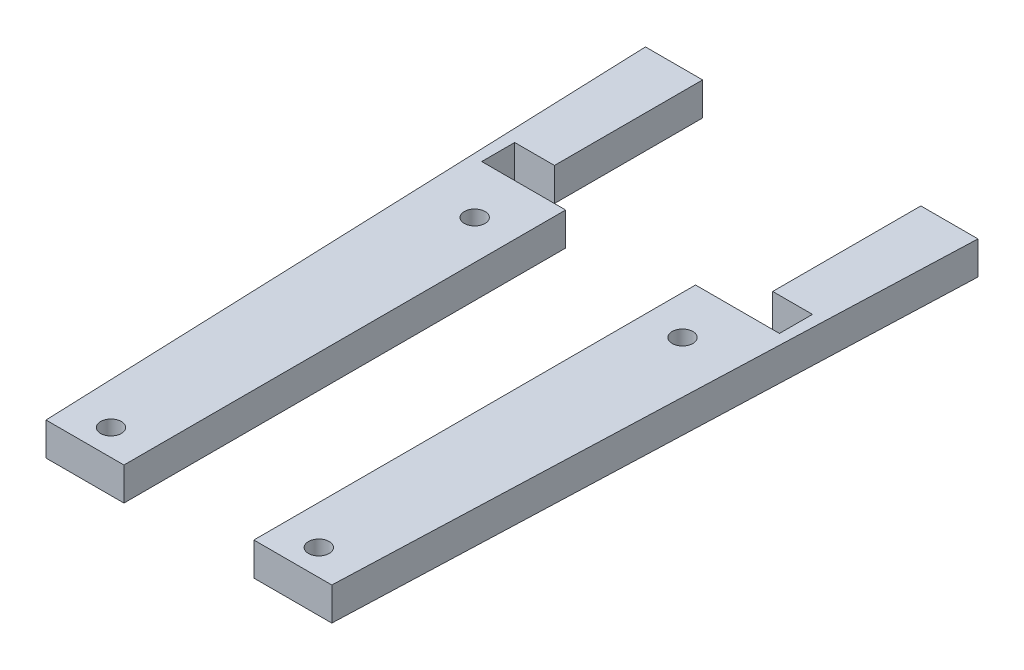
ISO-10303-21;
HEADER;
FILE_DESCRIPTION(('STEP AP214'),'2;1');
FILE_NAME('part.step','',(''),(''),'','','');
FILE_SCHEMA(('AUTOMOTIVE_DESIGN { 1 0 10303 214 1 1 1 1 }'));
ENDSEC;
DATA;
#1=APPLICATION_CONTEXT('core data for automotive mechanical design processes');
#2=APPLICATION_PROTOCOL_DEFINITION('international standard','automotive_design',2000,#1);
#3=PRODUCT_CONTEXT('',#1,'mechanical');
#4=PRODUCT('Part','Part','',(#3));
#5=PRODUCT_RELATED_PRODUCT_CATEGORY('part','',(#4));
#6=PRODUCT_DEFINITION_FORMATION('','',#4);
#7=PRODUCT_DEFINITION_CONTEXT('part definition',#1,'design');
#8=PRODUCT_DEFINITION('design','',#6,#7);
#9=PRODUCT_DEFINITION_SHAPE('','',#8);
#10=(LENGTH_UNIT() NAMED_UNIT(*) SI_UNIT(.MILLI.,.METRE.));
#11=(NAMED_UNIT(*) PLANE_ANGLE_UNIT() SI_UNIT($,.RADIAN.));
#12=(NAMED_UNIT(*) SI_UNIT($,.STERADIAN.) SOLID_ANGLE_UNIT());
#13=UNCERTAINTY_MEASURE_WITH_UNIT(LENGTH_MEASURE(1.E-05),#10,'distance_accuracy_value','');
#14=(GEOMETRIC_REPRESENTATION_CONTEXT(3) GLOBAL_UNCERTAINTY_ASSIGNED_CONTEXT((#13)) GLOBAL_UNIT_ASSIGNED_CONTEXT((#10,
#11,#12)) REPRESENTATION_CONTEXT('',''));
#15=CARTESIAN_POINT('',(0.,0.,0.));
#16=DIRECTION('',(0.,0.,1.));
#17=DIRECTION('',(1.,0.,0.));
#18=AXIS2_PLACEMENT_3D('',#15,#16,#17);
#19=CARTESIAN_POINT('',(0.,3.175,0.));
#20=DIRECTION('',(0.,1.,0.));
#21=DIRECTION('',(0.,0.,1.));
#22=AXIS2_PLACEMENT_3D('',#19,#20,#21);
#23=PLANE('',#22);
#24=CARTESIAN_POINT('',(-20.,3.175,194.859325526731));
#25=DIRECTION('',(0.,1.,0.));
#26=DIRECTION('',(0.,0.,1.));
#27=AXIS2_PLACEMENT_3D('',#24,#25,#26);
#28=CIRCLE('',#27,2.00000000000001);
#29=CARTESIAN_POINT('',(-20.,3.175,196.859325526731));
#30=VERTEX_POINT('',#29);
#31=EDGE_CURVE('E183',#30,#30,#28,.T.);
#32=ORIENTED_EDGE('',*,*,#31,.F.);
#33=EDGE_LOOP('',(#32));
#34=FACE_BOUND('',#33,.T.);
#35=CARTESIAN_POINT('',(-20.,3.175,124.859325526731));
#36=DIRECTION('',(0.,1.,0.));
#37=DIRECTION('',(0.,0.,-1.));
#38=AXIS2_PLACEMENT_3D('',#35,#36,#37);
#39=CIRCLE('',#38,2.00000000000001);
#40=CARTESIAN_POINT('',(-20.,3.175,122.859325526731));
#41=VERTEX_POINT('',#40);
#42=EDGE_CURVE('E177',#41,#41,#39,.T.);
#43=ORIENTED_EDGE('',*,*,#42,.F.);
#44=EDGE_LOOP('',(#43));
#45=FACE_BOUND('',#44,.T.);
#46=DIRECTION('',(-1.,0.,0.));
#47=VECTOR('',#46,1.);
#48=CARTESIAN_POINT('',(-1.96845672526672E-13,3.175,108.509325526731));
#49=LINE('',#48,#47);
#50=CARTESIAN_POINT('',(-21.,3.175,108.509325526731));
#51=VERTEX_POINT('',#50);
#52=CARTESIAN_POINT('',(-28.65,3.175,108.509325526731));
#53=VERTEX_POINT('',#52);
#54=EDGE_CURVE('E55',#51,#53,#49,.T.);
#55=ORIENTED_EDGE('',*,*,#54,.F.);
#56=DIRECTION('',(0.,0.,-1.));
#57=VECTOR('',#56,1.);
#58=CARTESIAN_POINT('',(-21.,3.175,0.));
#59=LINE('',#58,#57);
#60=CARTESIAN_POINT('',(-21.,3.175,80.));
#61=VERTEX_POINT('',#60);
#62=EDGE_CURVE('E119',#51,#61,#59,.T.);
#63=ORIENTED_EDGE('',*,*,#62,.T.);
#64=DIRECTION('',(-1.,0.,0.));
#65=VECTOR('',#64,1.);
#66=CARTESIAN_POINT('',(0.,3.175,80.));
#67=LINE('',#66,#65);
#68=CARTESIAN_POINT('',(-31.9978883976582,3.175,80.));
#69=VERTEX_POINT('',#68);
#70=EDGE_CURVE('E152',#61,#69,#67,.T.);
#71=ORIENTED_EDGE('',*,*,#70,.T.);
#72=DIRECTION('',(0.0375,0.,0.999296627633657));
#73=VECTOR('',#72,1.);
#74=CARTESIAN_POINT('',(-34.95078125,3.175,1.31157682376918));
#75=LINE('',#74,#73);
#76=CARTESIAN_POINT('',(-27.5,3.175,199.859325526731));
#77=VERTEX_POINT('',#76);
#78=EDGE_CURVE('E146',#69,#77,#75,.T.);
#79=ORIENTED_EDGE('',*,*,#78,.T.);
#80=DIRECTION('',(1.,0.,0.));
#81=VECTOR('',#80,1.);
#82=CARTESIAN_POINT('',(0.,3.175,199.859325526731));
#83=LINE('',#82,#81);
#84=CARTESIAN_POINT('',(-12.5,3.175,199.859325526731));
#85=VERTEX_POINT('',#84);
#86=EDGE_CURVE('E142',#77,#85,#83,.T.);
#87=ORIENTED_EDGE('',*,*,#86,.T.);
#88=DIRECTION('',(0.,0.,-1.));
#89=VECTOR('',#88,1.);
#90=CARTESIAN_POINT('',(-12.5,3.175,0.));
#91=LINE('',#90,#89);
#92=CARTESIAN_POINT('',(-12.5,3.175,114.859325526731));
#93=VERTEX_POINT('',#92);
#94=EDGE_CURVE('E145',#85,#93,#91,.T.);
#95=ORIENTED_EDGE('',*,*,#94,.T.);
#96=DIRECTION('',(-1.,0.,0.));
#97=VECTOR('',#96,1.);
#98=CARTESIAN_POINT('',(0.,3.175,114.859325526731));
#99=LINE('',#98,#97);
#100=CARTESIAN_POINT('',(-28.65,3.175,114.859325526731));
#101=VERTEX_POINT('',#100);
#102=EDGE_CURVE('E49',#93,#101,#99,.T.);
#103=ORIENTED_EDGE('',*,*,#102,.T.);
#104=DIRECTION('',(0.,0.,-1.));
#105=VECTOR('',#104,1.);
#106=CARTESIAN_POINT('',(-28.65,3.175,0.));
#107=LINE('',#106,#105);
#108=EDGE_CURVE('E127',#101,#53,#107,.T.);
#109=ORIENTED_EDGE('',*,*,#108,.T.);
#110=EDGE_LOOP('',(#55,#63,#71,#79,#87,#95,#103,#109));
#111=FACE_BOUND('',#110,.T.);
#112=ADVANCED_FACE('F45',(#34,#45,#111),#23,.T.);
#113=CARTESIAN_POINT('',(0.,-3.175,0.));
#114=DIRECTION('',(0.,1.,0.));
#115=DIRECTION('',(0.,0.,1.));
#116=AXIS2_PLACEMENT_3D('',#113,#114,#115);
#117=PLANE('',#116);
#118=CARTESIAN_POINT('',(-20.,-3.175,194.859325526731));
#119=DIRECTION('',(0.,1.,0.));
#120=DIRECTION('',(0.,0.,1.));
#121=AXIS2_PLACEMENT_3D('',#118,#119,#120);
#122=CIRCLE('',#121,2.00000000000001);
#123=CARTESIAN_POINT('',(-20.,-3.175,196.859325526731));
#124=VERTEX_POINT('',#123);
#125=EDGE_CURVE('E170',#124,#124,#122,.T.);
#126=ORIENTED_EDGE('',*,*,#125,.T.);
#127=EDGE_LOOP('',(#126));
#128=FACE_BOUND('',#127,.T.);
#129=CARTESIAN_POINT('',(-20.,-3.175,124.859325526731));
#130=DIRECTION('',(0.,1.,0.));
#131=DIRECTION('',(0.,0.,-1.));
#132=AXIS2_PLACEMENT_3D('',#129,#130,#131);
#133=CIRCLE('',#132,2.00000000000001);
#134=CARTESIAN_POINT('',(-20.,-3.175,122.859325526731));
#135=VERTEX_POINT('',#134);
#136=EDGE_CURVE('E180',#135,#135,#133,.T.);
#137=ORIENTED_EDGE('',*,*,#136,.T.);
#138=EDGE_LOOP('',(#137));
#139=FACE_BOUND('',#138,.T.);
#140=DIRECTION('',(0.,0.,-1.));
#141=VECTOR('',#140,1.);
#142=CARTESIAN_POINT('',(-21.,-3.175,0.));
#143=LINE('',#142,#141);
#144=CARTESIAN_POINT('',(-21.,-3.175,108.509325526731));
#145=VERTEX_POINT('',#144);
#146=CARTESIAN_POINT('',(-21.,-3.175,80.));
#147=VERTEX_POINT('',#146);
#148=EDGE_CURVE('E115',#145,#147,#143,.T.);
#149=ORIENTED_EDGE('',*,*,#148,.F.);
#150=DIRECTION('',(-1.,0.,0.));
#151=VECTOR('',#150,1.);
#152=CARTESIAN_POINT('',(-1.96845672526672E-13,-3.175,108.509325526731));
#153=LINE('',#152,#151);
#154=CARTESIAN_POINT('',(-28.65,-3.175,108.509325526731));
#155=VERTEX_POINT('',#154);
#156=EDGE_CURVE('E122',#145,#155,#153,.T.);
#157=ORIENTED_EDGE('',*,*,#156,.T.);
#158=DIRECTION('',(0.,0.,-1.));
#159=VECTOR('',#158,1.);
#160=CARTESIAN_POINT('',(-28.65,-3.175,0.));
#161=LINE('',#160,#159);
#162=CARTESIAN_POINT('',(-28.65,-3.175,114.859325526731));
#163=VERTEX_POINT('',#162);
#164=EDGE_CURVE('E84',#163,#155,#161,.T.);
#165=ORIENTED_EDGE('',*,*,#164,.F.);
#166=DIRECTION('',(-1.,0.,0.));
#167=VECTOR('',#166,1.);
#168=CARTESIAN_POINT('',(0.,-3.175,114.859325526731));
#169=LINE('',#168,#167);
#170=CARTESIAN_POINT('',(-12.5,-3.175,114.859325526731));
#171=VERTEX_POINT('',#170);
#172=EDGE_CURVE('E153',#171,#163,#169,.T.);
#173=ORIENTED_EDGE('',*,*,#172,.F.);
#174=DIRECTION('',(0.,0.,-1.));
#175=VECTOR('',#174,1.);
#176=CARTESIAN_POINT('',(-12.5,-3.175,0.));
#177=LINE('',#176,#175);
#178=CARTESIAN_POINT('',(-12.5,-3.175,199.859325526731));
#179=VERTEX_POINT('',#178);
#180=EDGE_CURVE('E136',#179,#171,#177,.T.);
#181=ORIENTED_EDGE('',*,*,#180,.F.);
#182=DIRECTION('',(1.,0.,0.));
#183=VECTOR('',#182,1.);
#184=CARTESIAN_POINT('',(0.,-3.175,199.859325526731));
#185=LINE('',#184,#183);
#186=CARTESIAN_POINT('',(-27.5,-3.175,199.859325526731));
#187=VERTEX_POINT('',#186);
#188=EDGE_CURVE('E147',#187,#179,#185,.T.);
#189=ORIENTED_EDGE('',*,*,#188,.F.);
#190=DIRECTION('',(0.0375,0.,0.999296627633657));
#191=VECTOR('',#190,1.);
#192=CARTESIAN_POINT('',(-34.95078125,-3.175,1.31157682376918));
#193=LINE('',#192,#191);
#194=CARTESIAN_POINT('',(-31.9978883976582,-3.175,80.));
#195=VERTEX_POINT('',#194);
#196=EDGE_CURVE('E134',#195,#187,#193,.T.);
#197=ORIENTED_EDGE('',*,*,#196,.F.);
#198=DIRECTION('',(-1.,0.,0.));
#199=VECTOR('',#198,1.);
#200=CARTESIAN_POINT('',(0.,-3.175,80.));
#201=LINE('',#200,#199);
#202=EDGE_CURVE('E132',#147,#195,#201,.T.);
#203=ORIENTED_EDGE('',*,*,#202,.F.);
#204=EDGE_LOOP('',(#149,#157,#165,#173,#181,#189,#197,#203));
#205=FACE_BOUND('',#204,.T.);
#206=ADVANCED_FACE('F130',(#128,#139,#205),#117,.F.);
#207=CARTESIAN_POINT('',(0.,3.175,199.859325526731));
#208=DIRECTION('',(0.,0.,-1.));
#209=DIRECTION('',(-1.,0.,0.));
#210=AXIS2_PLACEMENT_3D('',#207,#208,#209);
#211=PLANE('',#210);
#212=DIRECTION('',(0.,1.,0.));
#213=VECTOR('',#212,1.);
#214=CARTESIAN_POINT('',(-12.5,-3.175,199.859325526731));
#215=LINE('',#214,#213);
#216=EDGE_CURVE('E126',#179,#85,#215,.T.);
#217=ORIENTED_EDGE('',*,*,#216,.T.);
#218=ORIENTED_EDGE('',*,*,#86,.F.);
#219=DIRECTION('',(0.,-1.,0.));
#220=VECTOR('',#219,1.);
#221=CARTESIAN_POINT('',(-27.5,3.175,199.859325526731));
#222=LINE('',#221,#220);
#223=EDGE_CURVE('E150',#77,#187,#222,.T.);
#224=ORIENTED_EDGE('',*,*,#223,.T.);
#225=ORIENTED_EDGE('',*,*,#188,.T.);
#226=EDGE_LOOP('',(#217,#218,#224,#225));
#227=FACE_BOUND('',#226,.T.);
#228=ADVANCED_FACE('F208',(#227),#211,.F.);
#229=CARTESIAN_POINT('',(0.,-3.175,80.));
#230=DIRECTION('',(0.,0.,-1.));
#231=DIRECTION('',(-1.,0.,0.));
#232=AXIS2_PLACEMENT_3D('',#229,#230,#231);
#233=PLANE('',#232);
#234=ORIENTED_EDGE('',*,*,#70,.F.);
#235=DIRECTION('',(0.,1.,0.));
#236=VECTOR('',#235,1.);
#237=CARTESIAN_POINT('',(-21.,-3.175,80.));
#238=LINE('',#237,#236);
#239=EDGE_CURVE('E133',#147,#61,#238,.T.);
#240=ORIENTED_EDGE('',*,*,#239,.F.);
#241=ORIENTED_EDGE('',*,*,#202,.T.);
#242=DIRECTION('',(0.,1.,0.));
#243=VECTOR('',#242,1.);
#244=CARTESIAN_POINT('',(-31.9978883976582,-3.175,80.));
#245=LINE('',#244,#243);
#246=EDGE_CURVE('E138',#195,#69,#245,.T.);
#247=ORIENTED_EDGE('',*,*,#246,.T.);
#248=EDGE_LOOP('',(#234,#240,#241,#247));
#249=FACE_BOUND('',#248,.T.);
#250=ADVANCED_FACE('F216',(#249),#233,.T.);
#251=CARTESIAN_POINT('',(-34.95078125,3.175,1.31157682376918));
#252=DIRECTION('',(0.999296627633657,0.,-0.0375));
#253=DIRECTION('',(-0.0375,0.,-0.999296627633657));
#254=AXIS2_PLACEMENT_3D('',#251,#252,#253);
#255=PLANE('',#254);
#256=ORIENTED_EDGE('',*,*,#246,.F.);
#257=ORIENTED_EDGE('',*,*,#196,.T.);
#258=ORIENTED_EDGE('',*,*,#223,.F.);
#259=ORIENTED_EDGE('',*,*,#78,.F.);
#260=EDGE_LOOP('',(#256,#257,#258,#259));
#261=FACE_BOUND('',#260,.T.);
#262=ADVANCED_FACE('F214',(#261),#255,.F.);
#263=CARTESIAN_POINT('',(-21.,-3.175,0.));
#264=DIRECTION('',(1.,0.,0.));
#265=DIRECTION('',(0.,0.,-1.));
#266=AXIS2_PLACEMENT_3D('',#263,#264,#265);
#267=PLANE('',#266);
#268=ORIENTED_EDGE('',*,*,#62,.F.);
#269=DIRECTION('',(0.,1.,0.));
#270=VECTOR('',#269,1.);
#271=CARTESIAN_POINT('',(-21.,-3.175,108.509325526731));
#272=LINE('',#271,#270);
#273=EDGE_CURVE('E12',#145,#51,#272,.T.);
#274=ORIENTED_EDGE('',*,*,#273,.F.);
#275=ORIENTED_EDGE('',*,*,#148,.T.);
#276=ORIENTED_EDGE('',*,*,#239,.T.);
#277=EDGE_LOOP('',(#268,#274,#275,#276));
#278=FACE_BOUND('',#277,.T.);
#279=ADVANCED_FACE('F117',(#278),#267,.T.);
#280=CARTESIAN_POINT('',(-12.5,-3.175,0.));
#281=DIRECTION('',(1.,0.,0.));
#282=DIRECTION('',(0.,0.,-1.));
#283=AXIS2_PLACEMENT_3D('',#280,#281,#282);
#284=PLANE('',#283);
#285=ORIENTED_EDGE('',*,*,#94,.F.);
#286=ORIENTED_EDGE('',*,*,#216,.F.);
#287=ORIENTED_EDGE('',*,*,#180,.T.);
#288=DIRECTION('',(0.,1.,0.));
#289=VECTOR('',#288,1.);
#290=CARTESIAN_POINT('',(-12.5,-3.175,114.859325526731));
#291=LINE('',#290,#289);
#292=EDGE_CURVE('E154',#171,#93,#291,.T.);
#293=ORIENTED_EDGE('',*,*,#292,.T.);
#294=EDGE_LOOP('',(#285,#286,#287,#293));
#295=FACE_BOUND('',#294,.T.);
#296=ADVANCED_FACE('F217',(#295),#284,.T.);
#297=CARTESIAN_POINT('',(0.,-3.175,114.859325526731));
#298=DIRECTION('',(0.,0.,-1.));
#299=DIRECTION('',(-1.,0.,0.));
#300=AXIS2_PLACEMENT_3D('',#297,#298,#299);
#301=PLANE('',#300);
#302=ORIENTED_EDGE('',*,*,#102,.F.);
#303=ORIENTED_EDGE('',*,*,#292,.F.);
#304=ORIENTED_EDGE('',*,*,#172,.T.);
#305=DIRECTION('',(0.,1.,0.));
#306=VECTOR('',#305,1.);
#307=CARTESIAN_POINT('',(-28.65,-3.175,114.859325526731));
#308=LINE('',#307,#306);
#309=EDGE_CURVE('E89',#163,#101,#308,.T.);
#310=ORIENTED_EDGE('',*,*,#309,.T.);
#311=EDGE_LOOP('',(#302,#303,#304,#310));
#312=FACE_BOUND('',#311,.T.);
#313=ADVANCED_FACE('F47',(#312),#301,.T.);
#314=CARTESIAN_POINT('',(-28.65,-3.175,0.));
#315=DIRECTION('',(1.,0.,0.));
#316=DIRECTION('',(0.,0.,-1.));
#317=AXIS2_PLACEMENT_3D('',#314,#315,#316);
#318=PLANE('',#317);
#319=ORIENTED_EDGE('',*,*,#108,.F.);
#320=ORIENTED_EDGE('',*,*,#309,.F.);
#321=ORIENTED_EDGE('',*,*,#164,.T.);
#322=DIRECTION('',(0.,1.,0.));
#323=VECTOR('',#322,1.);
#324=CARTESIAN_POINT('',(-28.65,-3.175,108.509325526731));
#325=LINE('',#324,#323);
#326=EDGE_CURVE('E124',#155,#53,#325,.T.);
#327=ORIENTED_EDGE('',*,*,#326,.T.);
#328=EDGE_LOOP('',(#319,#320,#321,#327));
#329=FACE_BOUND('',#328,.T.);
#330=ADVANCED_FACE('F204',(#329),#318,.T.);
#331=CARTESIAN_POINT('',(-1.96845672526672E-13,-3.175,108.509325526731));
#332=DIRECTION('',(0.,0.,-1.));
#333=DIRECTION('',(-1.,0.,0.));
#334=AXIS2_PLACEMENT_3D('',#331,#332,#333);
#335=PLANE('',#334);
#336=ORIENTED_EDGE('',*,*,#54,.T.);
#337=ORIENTED_EDGE('',*,*,#326,.F.);
#338=ORIENTED_EDGE('',*,*,#156,.F.);
#339=ORIENTED_EDGE('',*,*,#273,.T.);
#340=EDGE_LOOP('',(#336,#337,#338,#339));
#341=FACE_BOUND('',#340,.T.);
#342=ADVANCED_FACE('F123',(#341),#335,.F.);
#343=CARTESIAN_POINT('',(-20.,-3.175,124.859325526731));
#344=DIRECTION('',(0.,1.,0.));
#345=DIRECTION('',(0.,0.,1.));
#346=AXIS2_PLACEMENT_3D('',#343,#344,#345);
#347=CYLINDRICAL_SURFACE('',#346,2.00000000000001);
#348=ORIENTED_EDGE('',*,*,#136,.F.);
#349=EDGE_LOOP('',(#348));
#350=FACE_BOUND('',#349,.T.);
#351=ORIENTED_EDGE('',*,*,#42,.T.);
#352=EDGE_LOOP('',(#351));
#353=FACE_BOUND('',#352,.T.);
#354=ADVANCED_FACE('F194',(#350,#353),#347,.F.);
#355=CARTESIAN_POINT('',(-20.,-3.175,194.859325526731));
#356=DIRECTION('',(0.,1.,0.));
#357=DIRECTION('',(0.,0.,1.));
#358=AXIS2_PLACEMENT_3D('',#355,#356,#357);
#359=CYLINDRICAL_SURFACE('',#358,2.00000000000001);
#360=ORIENTED_EDGE('',*,*,#125,.F.);
#361=EDGE_LOOP('',(#360));
#362=FACE_BOUND('',#361,.T.);
#363=ORIENTED_EDGE('',*,*,#31,.T.);
#364=EDGE_LOOP('',(#363));
#365=FACE_BOUND('',#364,.T.);
#366=ADVANCED_FACE('F191',(#362,#365),#359,.F.);
#367=CLOSED_SHELL('',(#112,#206,#228,#250,#262,#279,#296,#313,#330,#342,#354,#366));
#368=MANIFOLD_SOLID_BREP('B2',#367);
#369=CARTESIAN_POINT('',(34.95078125,3.175,1.31157682376918));
#370=DIRECTION('',(-0.999296627633657,0.,-0.0375));
#371=DIRECTION('',(-0.0375,0.,0.999296627633657));
#372=AXIS2_PLACEMENT_3D('',#369,#370,#371);
#373=PLANE('',#372);
#374=DIRECTION('',(0.,1.,0.));
#375=VECTOR('',#374,1.);
#376=CARTESIAN_POINT('',(31.9978883976582,-3.175,80.));
#377=LINE('',#376,#375);
#378=CARTESIAN_POINT('',(31.9978883976582,-3.175,80.));
#379=VERTEX_POINT('',#378);
#380=CARTESIAN_POINT('',(31.9978883976582,3.175,80.));
#381=VERTEX_POINT('',#380);
#382=EDGE_CURVE('E352',#379,#381,#377,.T.);
#383=ORIENTED_EDGE('',*,*,#382,.T.);
#384=DIRECTION('',(0.0375,0.,-0.999296627633657));
#385=VECTOR('',#384,1.);
#386=CARTESIAN_POINT('',(34.95078125,3.175,1.31157682376918));
#387=LINE('',#386,#385);
#388=CARTESIAN_POINT('',(27.5,3.175,199.859325526731));
#389=VERTEX_POINT('',#388);
#390=EDGE_CURVE('E419',#389,#381,#387,.T.);
#391=ORIENTED_EDGE('',*,*,#390,.F.);
#392=DIRECTION('',(0.,-1.,0.));
#393=VECTOR('',#392,1.);
#394=CARTESIAN_POINT('',(27.5,3.175,199.859325526731));
#395=LINE('',#394,#393);
#396=CARTESIAN_POINT('',(27.5,-3.175,199.859325526731));
#397=VERTEX_POINT('',#396);
#398=EDGE_CURVE('E43',#389,#397,#395,.T.);
#399=ORIENTED_EDGE('',*,*,#398,.T.);
#400=DIRECTION('',(0.0375,0.,-0.999296627633657));
#401=VECTOR('',#400,1.);
#402=CARTESIAN_POINT('',(34.95078125,-3.175,1.31157682376918));
#403=LINE('',#402,#401);
#404=EDGE_CURVE('E418',#397,#379,#403,.T.);
#405=ORIENTED_EDGE('',*,*,#404,.T.);
#406=EDGE_LOOP('',(#383,#391,#399,#405));
#407=FACE_BOUND('',#406,.T.);
#408=ADVANCED_FACE('F330',(#407),#373,.F.);
#409=CARTESIAN_POINT('',(0.,3.175,199.859325526731));
#410=DIRECTION('',(0.,0.,-1.));
#411=DIRECTION('',(-1.,0.,0.));
#412=AXIS2_PLACEMENT_3D('',#409,#410,#411);
#413=PLANE('',#412);
#414=DIRECTION('',(1.,0.,0.));
#415=VECTOR('',#414,1.);
#416=CARTESIAN_POINT('',(0.,3.175,199.859325526731));
#417=LINE('',#416,#415);
#418=CARTESIAN_POINT('',(12.5,3.175,199.859325526731));
#419=VERTEX_POINT('',#418);
#420=EDGE_CURVE('E337',#419,#389,#417,.T.);
#421=ORIENTED_EDGE('',*,*,#420,.F.);
#422=DIRECTION('',(0.,1.,0.));
#423=VECTOR('',#422,1.);
#424=CARTESIAN_POINT('',(12.5,-3.175,199.859325526731));
#425=LINE('',#424,#423);
#426=CARTESIAN_POINT('',(12.5,-3.175,199.859325526731));
#427=VERTEX_POINT('',#426);
#428=EDGE_CURVE('E399',#427,#419,#425,.T.);
#429=ORIENTED_EDGE('',*,*,#428,.F.);
#430=DIRECTION('',(1.,0.,0.));
#431=VECTOR('',#430,1.);
#432=CARTESIAN_POINT('',(0.,-3.175,199.859325526731));
#433=LINE('',#432,#431);
#434=EDGE_CURVE('E411',#427,#397,#433,.T.);
#435=ORIENTED_EDGE('',*,*,#434,.T.);
#436=ORIENTED_EDGE('',*,*,#398,.F.);
#437=EDGE_LOOP('',(#421,#429,#435,#436));
#438=FACE_BOUND('',#437,.T.);
#439=ADVANCED_FACE('F409',(#438),#413,.F.);
#440=CARTESIAN_POINT('',(0.,-3.175,80.));
#441=DIRECTION('',(0.,0.,-1.));
#442=DIRECTION('',(-1.,0.,0.));
#443=AXIS2_PLACEMENT_3D('',#440,#441,#442);
#444=PLANE('',#443);
#445=DIRECTION('',(0.,1.,0.));
#446=VECTOR('',#445,1.);
#447=CARTESIAN_POINT('',(21.,-3.175,80.));
#448=LINE('',#447,#446);
#449=CARTESIAN_POINT('',(21.,-3.175,80.));
#450=VERTEX_POINT('',#449);
#451=CARTESIAN_POINT('',(21.,3.175,80.));
#452=VERTEX_POINT('',#451);
#453=EDGE_CURVE('E430',#450,#452,#448,.T.);
#454=ORIENTED_EDGE('',*,*,#453,.T.);
#455=DIRECTION('',(-1.,0.,0.));
#456=VECTOR('',#455,1.);
#457=CARTESIAN_POINT('',(0.,3.175,80.));
#458=LINE('',#457,#456);
#459=EDGE_CURVE('E427',#381,#452,#458,.T.);
#460=ORIENTED_EDGE('',*,*,#459,.F.);
#461=ORIENTED_EDGE('',*,*,#382,.F.);
#462=DIRECTION('',(-1.,0.,0.));
#463=VECTOR('',#462,1.);
#464=CARTESIAN_POINT('',(0.,-3.175,80.));
#465=LINE('',#464,#463);
#466=EDGE_CURVE('E426',#379,#450,#465,.T.);
#467=ORIENTED_EDGE('',*,*,#466,.T.);
#468=EDGE_LOOP('',(#454,#460,#461,#467));
#469=FACE_BOUND('',#468,.T.);
#470=ADVANCED_FACE('F492',(#469),#444,.T.);
#471=CARTESIAN_POINT('',(0.,-3.175,0.));
#472=DIRECTION('',(0.,1.,0.));
#473=DIRECTION('',(0.,0.,1.));
#474=AXIS2_PLACEMENT_3D('',#471,#472,#473);
#475=PLANE('',#474);
#476=CARTESIAN_POINT('',(20.,-3.175,194.859325526731));
#477=DIRECTION('',(0.,1.,0.));
#478=DIRECTION('',(0.,0.,1.));
#479=AXIS2_PLACEMENT_3D('',#476,#477,#478);
#480=CIRCLE('',#479,2.00000000000001);
#481=CARTESIAN_POINT('',(20.,-3.175,196.859325526731));
#482=VERTEX_POINT('',#481);
#483=EDGE_CURVE('E450',#482,#482,#480,.T.);
#484=ORIENTED_EDGE('',*,*,#483,.T.);
#485=EDGE_LOOP('',(#484));
#486=FACE_BOUND('',#485,.T.);
#487=CARTESIAN_POINT('',(20.,-3.175,124.859325526731));
#488=DIRECTION('',(0.,1.,0.));
#489=DIRECTION('',(0.,0.,-1.));
#490=AXIS2_PLACEMENT_3D('',#487,#488,#489);
#491=CIRCLE('',#490,2.00000000000001);
#492=CARTESIAN_POINT('',(20.,-3.175,122.859325526731));
#493=VERTEX_POINT('',#492);
#494=EDGE_CURVE('E464',#493,#493,#491,.T.);
#495=ORIENTED_EDGE('',*,*,#494,.T.);
#496=EDGE_LOOP('',(#495));
#497=FACE_BOUND('',#496,.T.);
#498=DIRECTION('',(1.,0.,0.));
#499=VECTOR('',#498,1.);
#500=CARTESIAN_POINT('',(-1.96845672526672E-13,-3.175,108.509325526731));
#501=LINE('',#500,#499);
#502=CARTESIAN_POINT('',(21.,-3.175,108.509325526731));
#503=VERTEX_POINT('',#502);
#504=CARTESIAN_POINT('',(28.65,-3.175,108.509325526731));
#505=VERTEX_POINT('',#504);
#506=EDGE_CURVE('E455',#503,#505,#501,.T.);
#507=ORIENTED_EDGE('',*,*,#506,.F.);
#508=DIRECTION('',(0.,0.,-1.));
#509=VECTOR('',#508,1.);
#510=CARTESIAN_POINT('',(21.,-3.175,0.));
#511=LINE('',#510,#509);
#512=EDGE_CURVE('E412',#503,#450,#511,.T.);
#513=ORIENTED_EDGE('',*,*,#512,.T.);
#514=ORIENTED_EDGE('',*,*,#466,.F.);
#515=ORIENTED_EDGE('',*,*,#404,.F.);
#516=ORIENTED_EDGE('',*,*,#434,.F.);
#517=DIRECTION('',(0.,0.,-1.));
#518=VECTOR('',#517,1.);
#519=CARTESIAN_POINT('',(12.5,-3.175,0.));
#520=LINE('',#519,#518);
#521=CARTESIAN_POINT('',(12.5,-3.175,114.859325526731));
#522=VERTEX_POINT('',#521);
#523=EDGE_CURVE('E395',#427,#522,#520,.T.);
#524=ORIENTED_EDGE('',*,*,#523,.T.);
#525=DIRECTION('',(-1.,0.,0.));
#526=VECTOR('',#525,1.);
#527=CARTESIAN_POINT('',(0.,-3.175,114.859325526731));
#528=LINE('',#527,#526);
#529=CARTESIAN_POINT('',(28.65,-3.175,114.859325526731));
#530=VERTEX_POINT('',#529);
#531=EDGE_CURVE('E405',#530,#522,#528,.T.);
#532=ORIENTED_EDGE('',*,*,#531,.F.);
#533=DIRECTION('',(0.,0.,-1.));
#534=VECTOR('',#533,1.);
#535=CARTESIAN_POINT('',(28.6499999999999,-3.175,0.));
#536=LINE('',#535,#534);
#537=EDGE_CURVE('E457',#530,#505,#536,.T.);
#538=ORIENTED_EDGE('',*,*,#537,.T.);
#539=EDGE_LOOP('',(#507,#513,#514,#515,#516,#524,#532,#538));
#540=FACE_BOUND('',#539,.T.);
#541=ADVANCED_FACE('F416',(#486,#497,#540),#475,.F.);
#542=CARTESIAN_POINT('',(0.,3.175,0.));
#543=DIRECTION('',(0.,1.,0.));
#544=DIRECTION('',(0.,0.,1.));
#545=AXIS2_PLACEMENT_3D('',#542,#543,#544);
#546=PLANE('',#545);
#547=CARTESIAN_POINT('',(20.,3.175,194.859325526731));
#548=DIRECTION('',(0.,1.,0.));
#549=DIRECTION('',(0.,0.,1.));
#550=AXIS2_PLACEMENT_3D('',#547,#548,#549);
#551=CIRCLE('',#550,2.00000000000001);
#552=CARTESIAN_POINT('',(20.,3.175,196.859325526731));
#553=VERTEX_POINT('',#552);
#554=EDGE_CURVE('E467',#553,#553,#551,.T.);
#555=ORIENTED_EDGE('',*,*,#554,.F.);
#556=EDGE_LOOP('',(#555));
#557=FACE_BOUND('',#556,.T.);
#558=CARTESIAN_POINT('',(20.,3.175,124.859325526731));
#559=DIRECTION('',(0.,1.,0.));
#560=DIRECTION('',(0.,0.,-1.));
#561=AXIS2_PLACEMENT_3D('',#558,#559,#560);
#562=CIRCLE('',#561,2.00000000000001);
#563=CARTESIAN_POINT('',(20.,3.175,122.859325526731));
#564=VERTEX_POINT('',#563);
#565=EDGE_CURVE('E461',#564,#564,#562,.T.);
#566=ORIENTED_EDGE('',*,*,#565,.F.);
#567=EDGE_LOOP('',(#566));
#568=FACE_BOUND('',#567,.T.);
#569=DIRECTION('',(0.,0.,-1.));
#570=VECTOR('',#569,1.);
#571=CARTESIAN_POINT('',(21.,3.175,0.));
#572=LINE('',#571,#570);
#573=CARTESIAN_POINT('',(21.,3.175,108.509325526731));
#574=VERTEX_POINT('',#573);
#575=EDGE_CURVE('E344',#574,#452,#572,.T.);
#576=ORIENTED_EDGE('',*,*,#575,.F.);
#577=DIRECTION('',(1.,0.,0.));
#578=VECTOR('',#577,1.);
#579=CARTESIAN_POINT('',(-1.96845672526672E-13,3.175,108.509325526731));
#580=LINE('',#579,#578);
#581=CARTESIAN_POINT('',(28.65,3.175,108.509325526731));
#582=VERTEX_POINT('',#581);
#583=EDGE_CURVE('E441',#574,#582,#580,.T.);
#584=ORIENTED_EDGE('',*,*,#583,.T.);
#585=DIRECTION('',(0.,0.,-1.));
#586=VECTOR('',#585,1.);
#587=CARTESIAN_POINT('',(28.6499999999999,3.175,0.));
#588=LINE('',#587,#586);
#589=CARTESIAN_POINT('',(28.65,3.175,114.859325526731));
#590=VERTEX_POINT('',#589);
#591=EDGE_CURVE('E444',#590,#582,#588,.T.);
#592=ORIENTED_EDGE('',*,*,#591,.F.);
#593=DIRECTION('',(-1.,0.,0.));
#594=VECTOR('',#593,1.);
#595=CARTESIAN_POINT('',(0.,3.175,114.859325526731));
#596=LINE('',#595,#594);
#597=CARTESIAN_POINT('',(12.5,3.175,114.859325526731));
#598=VERTEX_POINT('',#597);
#599=EDGE_CURVE('E447',#590,#598,#596,.T.);
#600=ORIENTED_EDGE('',*,*,#599,.T.);
#601=DIRECTION('',(0.,0.,-1.));
#602=VECTOR('',#601,1.);
#603=CARTESIAN_POINT('',(12.5,3.175,0.));
#604=LINE('',#603,#602);
#605=EDGE_CURVE('E448',#419,#598,#604,.T.);
#606=ORIENTED_EDGE('',*,*,#605,.F.);
#607=ORIENTED_EDGE('',*,*,#420,.T.);
#608=ORIENTED_EDGE('',*,*,#390,.T.);
#609=ORIENTED_EDGE('',*,*,#459,.T.);
#610=EDGE_LOOP('',(#576,#584,#592,#600,#606,#607,#608,#609));
#611=FACE_BOUND('',#610,.T.);
#612=ADVANCED_FACE('F482',(#557,#568,#611),#546,.T.);
#613=CARTESIAN_POINT('',(21.,-3.175,0.));
#614=DIRECTION('',(1.,0.,0.));
#615=DIRECTION('',(0.,0.,-1.));
#616=AXIS2_PLACEMENT_3D('',#613,#614,#615);
#617=PLANE('',#616);
#618=ORIENTED_EDGE('',*,*,#575,.T.);
#619=ORIENTED_EDGE('',*,*,#453,.F.);
#620=ORIENTED_EDGE('',*,*,#512,.F.);
#621=DIRECTION('',(0.,1.,0.));
#622=VECTOR('',#621,1.);
#623=CARTESIAN_POINT('',(21.,-3.175,108.509325526731));
#624=LINE('',#623,#622);
#625=EDGE_CURVE('E437',#503,#574,#624,.T.);
#626=ORIENTED_EDGE('',*,*,#625,.T.);
#627=EDGE_LOOP('',(#618,#619,#620,#626));
#628=FACE_BOUND('',#627,.T.);
#629=ADVANCED_FACE('F485',(#628),#617,.F.);
#630=CARTESIAN_POINT('',(12.5,-3.175,0.));
#631=DIRECTION('',(1.,0.,0.));
#632=DIRECTION('',(0.,0.,-1.));
#633=AXIS2_PLACEMENT_3D('',#630,#631,#632);
#634=PLANE('',#633);
#635=ORIENTED_EDGE('',*,*,#605,.T.);
#636=DIRECTION('',(0.,1.,0.));
#637=VECTOR('',#636,1.);
#638=CARTESIAN_POINT('',(12.5,-3.175,114.859325526731));
#639=LINE('',#638,#637);
#640=EDGE_CURVE('E401',#522,#598,#639,.T.);
#641=ORIENTED_EDGE('',*,*,#640,.F.);
#642=ORIENTED_EDGE('',*,*,#523,.F.);
#643=ORIENTED_EDGE('',*,*,#428,.T.);
#644=EDGE_LOOP('',(#635,#641,#642,#643));
#645=FACE_BOUND('',#644,.T.);
#646=ADVANCED_FACE('F398',(#645),#634,.F.);
#647=CARTESIAN_POINT('',(0.,-3.175,114.859325526731));
#648=DIRECTION('',(0.,0.,-1.));
#649=DIRECTION('',(-1.,0.,0.));
#650=AXIS2_PLACEMENT_3D('',#647,#648,#649);
#651=PLANE('',#650);
#652=ORIENTED_EDGE('',*,*,#599,.F.);
#653=DIRECTION('',(0.,1.,0.));
#654=VECTOR('',#653,1.);
#655=CARTESIAN_POINT('',(28.65,-3.175,114.859325526731));
#656=LINE('',#655,#654);
#657=EDGE_CURVE('E433',#530,#590,#656,.T.);
#658=ORIENTED_EDGE('',*,*,#657,.F.);
#659=ORIENTED_EDGE('',*,*,#531,.T.);
#660=ORIENTED_EDGE('',*,*,#640,.T.);
#661=EDGE_LOOP('',(#652,#658,#659,#660));
#662=FACE_BOUND('',#661,.T.);
#663=ADVANCED_FACE('F507',(#662),#651,.T.);
#664=CARTESIAN_POINT('',(28.6499999999999,-3.175,0.));
#665=DIRECTION('',(1.,0.,0.));
#666=DIRECTION('',(0.,0.,-1.));
#667=AXIS2_PLACEMENT_3D('',#664,#665,#666);
#668=PLANE('',#667);
#669=ORIENTED_EDGE('',*,*,#591,.T.);
#670=DIRECTION('',(0.,1.,0.));
#671=VECTOR('',#670,1.);
#672=CARTESIAN_POINT('',(28.65,-3.175,108.509325526731));
#673=LINE('',#672,#671);
#674=EDGE_CURVE('E435',#505,#582,#673,.T.);
#675=ORIENTED_EDGE('',*,*,#674,.F.);
#676=ORIENTED_EDGE('',*,*,#537,.F.);
#677=ORIENTED_EDGE('',*,*,#657,.T.);
#678=EDGE_LOOP('',(#669,#675,#676,#677));
#679=FACE_BOUND('',#678,.T.);
#680=ADVANCED_FACE('F510',(#679),#668,.F.);
#681=CARTESIAN_POINT('',(-1.96845672526672E-13,-3.175,108.509325526731));
#682=DIRECTION('',(0.,0.,1.));
#683=DIRECTION('',(1.,0.,0.));
#684=AXIS2_PLACEMENT_3D('',#681,#682,#683);
#685=PLANE('',#684);
#686=ORIENTED_EDGE('',*,*,#583,.F.);
#687=ORIENTED_EDGE('',*,*,#625,.F.);
#688=ORIENTED_EDGE('',*,*,#506,.T.);
#689=ORIENTED_EDGE('',*,*,#674,.T.);
#690=EDGE_LOOP('',(#686,#687,#688,#689));
#691=FACE_BOUND('',#690,.T.);
#692=ADVANCED_FACE('F514',(#691),#685,.T.);
#693=CARTESIAN_POINT('',(20.,-3.175,124.859325526731));
#694=DIRECTION('',(0.,1.,0.));
#695=DIRECTION('',(0.,0.,1.));
#696=AXIS2_PLACEMENT_3D('',#693,#694,#695);
#697=CYLINDRICAL_SURFACE('',#696,2.00000000000001);
#698=ORIENTED_EDGE('',*,*,#494,.F.);
#699=EDGE_LOOP('',(#698));
#700=FACE_BOUND('',#699,.T.);
#701=ORIENTED_EDGE('',*,*,#565,.T.);
#702=EDGE_LOOP('',(#701));
#703=FACE_BOUND('',#702,.T.);
#704=ADVANCED_FACE('F478',(#700,#703),#697,.F.);
#705=CARTESIAN_POINT('',(20.,-3.175,194.859325526731));
#706=DIRECTION('',(0.,1.,0.));
#707=DIRECTION('',(0.,0.,1.));
#708=AXIS2_PLACEMENT_3D('',#705,#706,#707);
#709=CYLINDRICAL_SURFACE('',#708,2.00000000000001);
#710=ORIENTED_EDGE('',*,*,#483,.F.);
#711=EDGE_LOOP('',(#710));
#712=FACE_BOUND('',#711,.T.);
#713=ORIENTED_EDGE('',*,*,#554,.T.);
#714=EDGE_LOOP('',(#713));
#715=FACE_BOUND('',#714,.T.);
#716=ADVANCED_FACE('F475',(#712,#715),#709,.F.);
#717=CLOSED_SHELL('',(#408,#439,#470,#541,#612,#629,#646,#663,#680,#692,#704,#716));
#718=MANIFOLD_SOLID_BREP('B6',#717);
#719=ADVANCED_BREP_SHAPE_REPRESENTATION('',(#18,#368,#718),#14);
#720=SHAPE_DEFINITION_REPRESENTATION(#9,#719);
ENDSEC;
END-ISO-10303-21;
